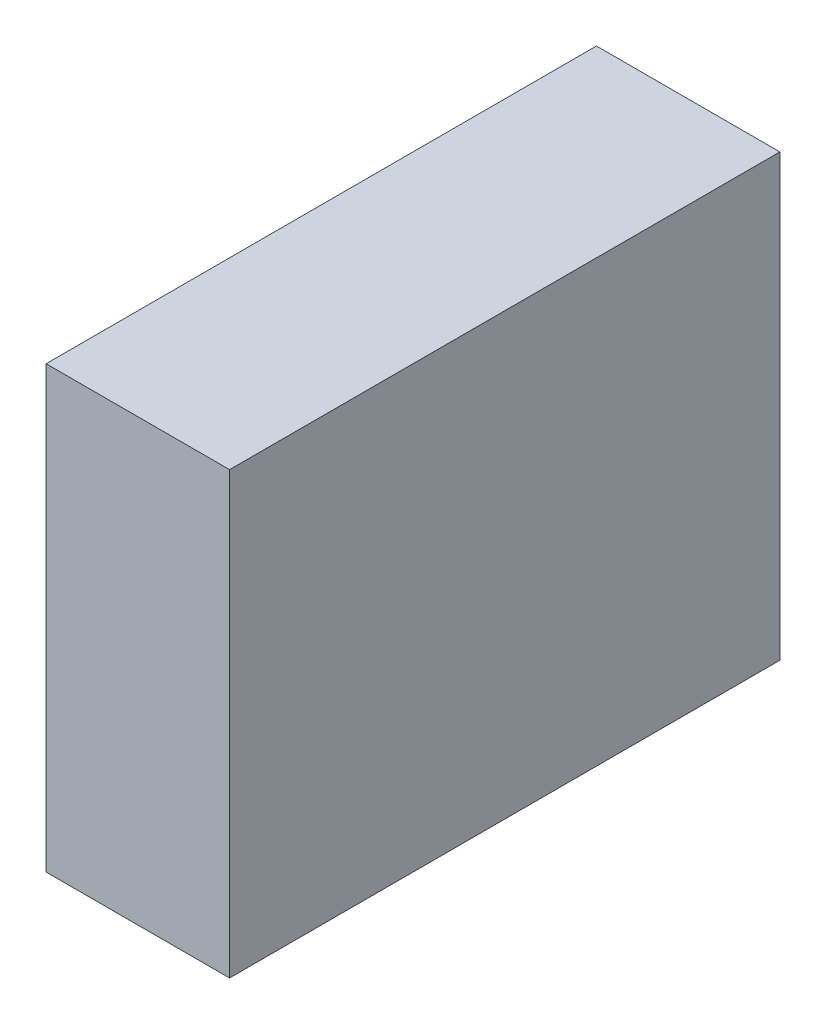
ISO-10303-21;
HEADER;
FILE_DESCRIPTION(('STEP AP214'),'2;1');
FILE_NAME('part.step','',(''),(''),'','','');
FILE_SCHEMA(('AUTOMOTIVE_DESIGN { 1 0 10303 214 1 1 1 1 }'));
ENDSEC;
DATA;
#1=APPLICATION_CONTEXT('core data for automotive mechanical design processes');
#2=APPLICATION_PROTOCOL_DEFINITION('international standard','automotive_design',2000,#1);
#3=PRODUCT_CONTEXT('',#1,'mechanical');
#4=PRODUCT('Part','Part','',(#3));
#5=PRODUCT_RELATED_PRODUCT_CATEGORY('part','',(#4));
#6=PRODUCT_DEFINITION_FORMATION('','',#4);
#7=PRODUCT_DEFINITION_CONTEXT('part definition',#1,'design');
#8=PRODUCT_DEFINITION('design','',#6,#7);
#9=PRODUCT_DEFINITION_SHAPE('','',#8);
#10=(LENGTH_UNIT() NAMED_UNIT(*) SI_UNIT(.MILLI.,.METRE.));
#11=(NAMED_UNIT(*) PLANE_ANGLE_UNIT() SI_UNIT($,.RADIAN.));
#12=(NAMED_UNIT(*) SI_UNIT($,.STERADIAN.) SOLID_ANGLE_UNIT());
#13=UNCERTAINTY_MEASURE_WITH_UNIT(LENGTH_MEASURE(1.E-05),#10,'distance_accuracy_value','');
#14=(GEOMETRIC_REPRESENTATION_CONTEXT(3) GLOBAL_UNCERTAINTY_ASSIGNED_CONTEXT((#13)) GLOBAL_UNIT_ASSIGNED_CONTEXT((#10,
#11,#12)) REPRESENTATION_CONTEXT('',''));
#15=CARTESIAN_POINT('',(0.,0.,0.));
#16=DIRECTION('',(0.,0.,1.));
#17=DIRECTION('',(1.,0.,0.));
#18=AXIS2_PLACEMENT_3D('',#15,#16,#17);
#19=CARTESIAN_POINT('',(22.3648648648648,12.,-82.6013513513514));
#20=DIRECTION('',(1.,0.,0.));
#21=DIRECTION('',(0.,0.,-1.));
#22=AXIS2_PLACEMENT_3D('',#19,#20,#21);
#23=PLANE('',#22);
#24=DIRECTION('',(0.,0.,1.));
#25=VECTOR('',#24,1.);
#26=CARTESIAN_POINT('',(22.3648648648648,0.,-82.6013513513514));
#27=LINE('',#26,#25);
#28=CARTESIAN_POINT('',(22.3648648648648,0.,-82.6013513513514));
#29=VERTEX_POINT('',#28);
#30=CARTESIAN_POINT('',(22.3648648648648,0.,-67.6013513513514));
#31=VERTEX_POINT('',#30);
#32=EDGE_CURVE('E96',#29,#31,#27,.T.);
#33=ORIENTED_EDGE('',*,*,#32,.T.);
#34=DIRECTION('',(0.,-1.,0.));
#35=VECTOR('',#34,1.);
#36=CARTESIAN_POINT('',(22.3648648648648,12.,-67.6013513513514));
#37=LINE('',#36,#35);
#38=CARTESIAN_POINT('',(22.3648648648648,12.,-67.6013513513514));
#39=VERTEX_POINT('',#38);
#40=EDGE_CURVE('E11',#39,#31,#37,.T.);
#41=ORIENTED_EDGE('',*,*,#40,.F.);
#42=DIRECTION('',(0.,0.,1.));
#43=VECTOR('',#42,1.);
#44=CARTESIAN_POINT('',(22.3648648648648,12.,-82.6013513513514));
#45=LINE('',#44,#43);
#46=CARTESIAN_POINT('',(22.3648648648648,12.,-82.6013513513514));
#47=VERTEX_POINT('',#46);
#48=EDGE_CURVE('E84',#47,#39,#45,.T.);
#49=ORIENTED_EDGE('',*,*,#48,.F.);
#50=DIRECTION('',(0.,-1.,0.));
#51=VECTOR('',#50,1.);
#52=CARTESIAN_POINT('',(22.3648648648648,12.,-82.6013513513514));
#53=LINE('',#52,#51);
#54=EDGE_CURVE('E92',#47,#29,#53,.T.);
#55=ORIENTED_EDGE('',*,*,#54,.T.);
#56=EDGE_LOOP('',(#33,#41,#49,#55));
#57=FACE_BOUND('',#56,.T.);
#58=ADVANCED_FACE('F33',(#57),#23,.F.);
#59=CARTESIAN_POINT('',(22.3648648648648,12.,-67.6013513513514));
#60=DIRECTION('',(0.,0.,-1.));
#61=DIRECTION('',(-1.,0.,0.));
#62=AXIS2_PLACEMENT_3D('',#59,#60,#61);
#63=PLANE('',#62);
#64=DIRECTION('',(1.,0.,0.));
#65=VECTOR('',#64,1.);
#66=CARTESIAN_POINT('',(22.3648648648648,0.,-67.6013513513514));
#67=LINE('',#66,#65);
#68=CARTESIAN_POINT('',(27.3648648648648,0.,-67.6013513513514));
#69=VERTEX_POINT('',#68);
#70=EDGE_CURVE('E88',#31,#69,#67,.T.);
#71=ORIENTED_EDGE('',*,*,#70,.T.);
#72=DIRECTION('',(0.,-1.,0.));
#73=VECTOR('',#72,1.);
#74=CARTESIAN_POINT('',(27.3648648648648,12.,-67.6013513513514));
#75=LINE('',#74,#73);
#76=CARTESIAN_POINT('',(27.3648648648648,12.,-67.6013513513514));
#77=VERTEX_POINT('',#76);
#78=EDGE_CURVE('E41',#77,#69,#75,.T.);
#79=ORIENTED_EDGE('',*,*,#78,.F.);
#80=DIRECTION('',(1.,0.,0.));
#81=VECTOR('',#80,1.);
#82=CARTESIAN_POINT('',(22.3648648648648,12.,-67.6013513513514));
#83=LINE('',#82,#81);
#84=EDGE_CURVE('E79',#39,#77,#83,.T.);
#85=ORIENTED_EDGE('',*,*,#84,.F.);
#86=ORIENTED_EDGE('',*,*,#40,.T.);
#87=EDGE_LOOP('',(#71,#79,#85,#86));
#88=FACE_BOUND('',#87,.T.);
#89=ADVANCED_FACE('F87',(#88),#63,.F.);
#90=CARTESIAN_POINT('',(27.3648648648648,12.,-82.6013513513514));
#91=DIRECTION('',(-1.,0.,0.));
#92=DIRECTION('',(0.,0.,1.));
#93=AXIS2_PLACEMENT_3D('',#90,#91,#92);
#94=PLANE('',#93);
#95=DIRECTION('',(0.,0.,-1.));
#96=VECTOR('',#95,1.);
#97=CARTESIAN_POINT('',(27.3648648648648,0.,-82.6013513513514));
#98=LINE('',#97,#96);
#99=CARTESIAN_POINT('',(27.3648648648648,0.,-82.6013513513514));
#100=VERTEX_POINT('',#99);
#101=EDGE_CURVE('E66',#69,#100,#98,.T.);
#102=ORIENTED_EDGE('',*,*,#101,.T.);
#103=DIRECTION('',(0.,-1.,0.));
#104=VECTOR('',#103,1.);
#105=CARTESIAN_POINT('',(27.3648648648648,12.,-82.6013513513514));
#106=LINE('',#105,#104);
#107=CARTESIAN_POINT('',(27.3648648648648,12.,-82.6013513513514));
#108=VERTEX_POINT('',#107);
#109=EDGE_CURVE('E89',#108,#100,#106,.T.);
#110=ORIENTED_EDGE('',*,*,#109,.F.);
#111=DIRECTION('',(0.,0.,-1.));
#112=VECTOR('',#111,1.);
#113=CARTESIAN_POINT('',(27.3648648648648,12.,-82.6013513513514));
#114=LINE('',#113,#112);
#115=EDGE_CURVE('E82',#77,#108,#114,.T.);
#116=ORIENTED_EDGE('',*,*,#115,.F.);
#117=ORIENTED_EDGE('',*,*,#78,.T.);
#118=EDGE_LOOP('',(#102,#110,#116,#117));
#119=FACE_BOUND('',#118,.T.);
#120=ADVANCED_FACE('F90',(#119),#94,.F.);
#121=CARTESIAN_POINT('',(22.3648648648648,12.,-82.6013513513514));
#122=DIRECTION('',(0.,0.,1.));
#123=DIRECTION('',(1.,0.,0.));
#124=AXIS2_PLACEMENT_3D('',#121,#122,#123);
#125=PLANE('',#124);
#126=DIRECTION('',(-1.,0.,0.));
#127=VECTOR('',#126,1.);
#128=CARTESIAN_POINT('',(22.3648648648648,0.,-82.6013513513514));
#129=LINE('',#128,#127);
#130=EDGE_CURVE('E72',#100,#29,#129,.T.);
#131=ORIENTED_EDGE('',*,*,#130,.T.);
#132=ORIENTED_EDGE('',*,*,#54,.F.);
#133=DIRECTION('',(-1.,0.,0.));
#134=VECTOR('',#133,1.);
#135=CARTESIAN_POINT('',(22.3648648648648,12.,-82.6013513513514));
#136=LINE('',#135,#134);
#137=EDGE_CURVE('E49',#108,#47,#136,.T.);
#138=ORIENTED_EDGE('',*,*,#137,.F.);
#139=ORIENTED_EDGE('',*,*,#109,.T.);
#140=EDGE_LOOP('',(#131,#132,#138,#139));
#141=FACE_BOUND('',#140,.T.);
#142=ADVANCED_FACE('F103',(#141),#125,.F.);
#143=CARTESIAN_POINT('',(0.,12.,0.));
#144=DIRECTION('',(0.,1.,0.));
#145=DIRECTION('',(0.,0.,1.));
#146=AXIS2_PLACEMENT_3D('',#143,#144,#145);
#147=PLANE('',#146);
#148=ORIENTED_EDGE('',*,*,#48,.T.);
#149=ORIENTED_EDGE('',*,*,#84,.T.);
#150=ORIENTED_EDGE('',*,*,#115,.T.);
#151=ORIENTED_EDGE('',*,*,#137,.T.);
#152=EDGE_LOOP('',(#148,#149,#150,#151));
#153=FACE_BOUND('',#152,.T.);
#154=ADVANCED_FACE('F80',(#153),#147,.T.);
#155=CARTESIAN_POINT('',(0.,0.,0.));
#156=DIRECTION('',(0.,1.,0.));
#157=DIRECTION('',(0.,0.,1.));
#158=AXIS2_PLACEMENT_3D('',#155,#156,#157);
#159=PLANE('',#158);
#160=ORIENTED_EDGE('',*,*,#32,.F.);
#161=ORIENTED_EDGE('',*,*,#130,.F.);
#162=ORIENTED_EDGE('',*,*,#101,.F.);
#163=ORIENTED_EDGE('',*,*,#70,.F.);
#164=EDGE_LOOP('',(#160,#161,#162,#163));
#165=FACE_BOUND('',#164,.T.);
#166=ADVANCED_FACE('F106',(#165),#159,.F.);
#167=CLOSED_SHELL('',(#58,#89,#120,#142,#154,#166));
#168=MANIFOLD_SOLID_BREP('B2',#167);
#169=ADVANCED_BREP_SHAPE_REPRESENTATION('',(#18,#168),#14);
#170=SHAPE_DEFINITION_REPRESENTATION(#9,#169);
ENDSEC;
END-ISO-10303-21;
